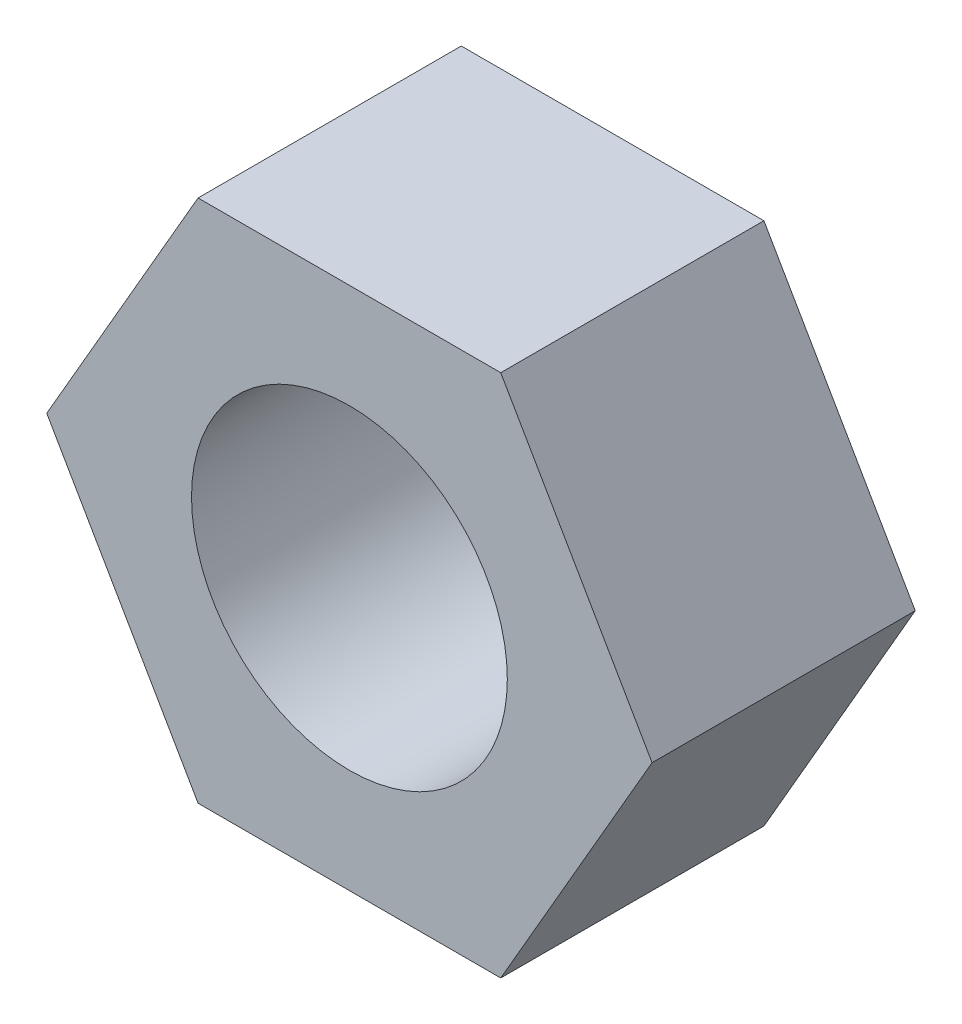
ISO-10303-21;
HEADER;
FILE_DESCRIPTION(('STEP AP214'),'2;1');
FILE_NAME('part.step','',(''),(''),'','','');
FILE_SCHEMA(('AUTOMOTIVE_DESIGN { 1 0 10303 214 1 1 1 1 }'));
ENDSEC;
DATA;
#1=APPLICATION_CONTEXT('core data for automotive mechanical design processes');
#2=APPLICATION_PROTOCOL_DEFINITION('international standard','automotive_design',2000,#1);
#3=PRODUCT_CONTEXT('',#1,'mechanical');
#4=PRODUCT('Part','Part','',(#3));
#5=PRODUCT_RELATED_PRODUCT_CATEGORY('part','',(#4));
#6=PRODUCT_DEFINITION_FORMATION('','',#4);
#7=PRODUCT_DEFINITION_CONTEXT('part definition',#1,'design');
#8=PRODUCT_DEFINITION('design','',#6,#7);
#9=PRODUCT_DEFINITION_SHAPE('','',#8);
#10=(LENGTH_UNIT() NAMED_UNIT(*) SI_UNIT(.MILLI.,.METRE.));
#11=(NAMED_UNIT(*) PLANE_ANGLE_UNIT() SI_UNIT($,.RADIAN.));
#12=(NAMED_UNIT(*) SI_UNIT($,.STERADIAN.) SOLID_ANGLE_UNIT());
#13=UNCERTAINTY_MEASURE_WITH_UNIT(LENGTH_MEASURE(1.E-05),#10,'distance_accuracy_value','');
#14=(GEOMETRIC_REPRESENTATION_CONTEXT(3) GLOBAL_UNCERTAINTY_ASSIGNED_CONTEXT((#13)) GLOBAL_UNIT_ASSIGNED_CONTEXT((#10,
#11,#12)) REPRESENTATION_CONTEXT('',''));
#15=CARTESIAN_POINT('',(0.,0.,0.));
#16=DIRECTION('',(0.,0.,1.));
#17=DIRECTION('',(1.,0.,0.));
#18=AXIS2_PLACEMENT_3D('',#15,#16,#17);
#19=CARTESIAN_POINT('',(0.,0.,5.));
#20=DIRECTION('',(0.,0.,1.));
#21=DIRECTION('',(1.,0.,0.));
#22=AXIS2_PLACEMENT_3D('',#19,#20,#21);
#23=PLANE('',#22);
#24=DIRECTION('',(-1.,0.,0.));
#25=VECTOR('',#24,1.);
#26=CARTESIAN_POINT('',(2.875,4.97964607176052,5.));
#27=LINE('',#26,#25);
#28=CARTESIAN_POINT('',(2.875,4.97964607176052,5.));
#29=VERTEX_POINT('',#28);
#30=CARTESIAN_POINT('',(-2.875,4.97964607176052,5.));
#31=VERTEX_POINT('',#30);
#32=EDGE_CURVE('E130',#29,#31,#27,.T.);
#33=ORIENTED_EDGE('',*,*,#32,.T.);
#34=DIRECTION('',(-0.5,-0.866025403784439,0.));
#35=VECTOR('',#34,1.);
#36=CARTESIAN_POINT('',(-2.875,4.97964607176052,5.));
#37=LINE('',#36,#35);
#38=CARTESIAN_POINT('',(-5.75,0.,5.));
#39=VERTEX_POINT('',#38);
#40=EDGE_CURVE('E88',#31,#39,#37,.T.);
#41=ORIENTED_EDGE('',*,*,#40,.T.);
#42=DIRECTION('',(0.5,-0.866025403784438,0.));
#43=VECTOR('',#42,1.);
#44=CARTESIAN_POINT('',(-5.75,0.,5.));
#45=LINE('',#44,#43);
#46=CARTESIAN_POINT('',(-2.87499999999999,-4.97964607176052,5.));
#47=VERTEX_POINT('',#46);
#48=EDGE_CURVE('E101',#39,#47,#45,.T.);
#49=ORIENTED_EDGE('',*,*,#48,.T.);
#50=DIRECTION('',(1.,0.,0.));
#51=VECTOR('',#50,1.);
#52=CARTESIAN_POINT('',(-2.87499999999999,-4.97964607176052,5.));
#53=LINE('',#52,#51);
#54=CARTESIAN_POINT('',(2.875,-4.97964607176052,5.));
#55=VERTEX_POINT('',#54);
#56=EDGE_CURVE('E95',#47,#55,#53,.T.);
#57=ORIENTED_EDGE('',*,*,#56,.T.);
#58=DIRECTION('',(0.5,0.866025403784439,0.));
#59=VECTOR('',#58,1.);
#60=CARTESIAN_POINT('',(2.875,-4.97964607176052,5.));
#61=LINE('',#60,#59);
#62=CARTESIAN_POINT('',(5.75,0.,5.));
#63=VERTEX_POINT('',#62);
#64=EDGE_CURVE('E99',#55,#63,#61,.T.);
#65=ORIENTED_EDGE('',*,*,#64,.T.);
#66=DIRECTION('',(-0.5,0.866025403784439,0.));
#67=VECTOR('',#66,1.);
#68=CARTESIAN_POINT('',(5.75,0.,5.));
#69=LINE('',#68,#67);
#70=EDGE_CURVE('E51',#63,#29,#69,.T.);
#71=ORIENTED_EDGE('',*,*,#70,.T.);
#72=EDGE_LOOP('',(#33,#41,#49,#57,#65,#71));
#73=FACE_BOUND('',#72,.T.);
#74=CARTESIAN_POINT('',(0.,0.,5.));
#75=DIRECTION('',(0.,0.,1.));
#76=DIRECTION('',(1.,0.,0.));
#77=AXIS2_PLACEMENT_3D('',#74,#75,#76);
#78=CIRCLE('',#77,3.);
#79=CARTESIAN_POINT('',(3.,0.,5.));
#80=VERTEX_POINT('',#79);
#81=EDGE_CURVE('E123',#80,#80,#78,.T.);
#82=ORIENTED_EDGE('',*,*,#81,.F.);
#83=EDGE_LOOP('',(#82));
#84=FACE_BOUND('',#83,.T.);
#85=ADVANCED_FACE('F34',(#73,#84),#23,.T.);
#86=CARTESIAN_POINT('',(0.,0.,0.));
#87=DIRECTION('',(0.,0.,1.));
#88=DIRECTION('',(1.,0.,0.));
#89=AXIS2_PLACEMENT_3D('',#86,#87,#88);
#90=PLANE('',#89);
#91=DIRECTION('',(-1.,0.,0.));
#92=VECTOR('',#91,1.);
#93=CARTESIAN_POINT('',(2.875,4.97964607176052,0.));
#94=LINE('',#93,#92);
#95=CARTESIAN_POINT('',(2.875,4.97964607176052,0.));
#96=VERTEX_POINT('',#95);
#97=CARTESIAN_POINT('',(-2.875,4.97964607176052,0.));
#98=VERTEX_POINT('',#97);
#99=EDGE_CURVE('E119',#96,#98,#94,.T.);
#100=ORIENTED_EDGE('',*,*,#99,.F.);
#101=DIRECTION('',(-0.5,0.866025403784439,0.));
#102=VECTOR('',#101,1.);
#103=CARTESIAN_POINT('',(5.75,0.,0.));
#104=LINE('',#103,#102);
#105=CARTESIAN_POINT('',(5.75,0.,0.));
#106=VERTEX_POINT('',#105);
#107=EDGE_CURVE('E80',#106,#96,#104,.T.);
#108=ORIENTED_EDGE('',*,*,#107,.F.);
#109=DIRECTION('',(0.5,0.866025403784439,0.));
#110=VECTOR('',#109,1.);
#111=CARTESIAN_POINT('',(2.875,-4.97964607176052,0.));
#112=LINE('',#111,#110);
#113=CARTESIAN_POINT('',(2.875,-4.97964607176052,0.));
#114=VERTEX_POINT('',#113);
#115=EDGE_CURVE('E74',#114,#106,#112,.T.);
#116=ORIENTED_EDGE('',*,*,#115,.F.);
#117=DIRECTION('',(1.,0.,0.));
#118=VECTOR('',#117,1.);
#119=CARTESIAN_POINT('',(-2.87499999999999,-4.97964607176052,0.));
#120=LINE('',#119,#118);
#121=CARTESIAN_POINT('',(-2.87499999999999,-4.97964607176052,0.));
#122=VERTEX_POINT('',#121);
#123=EDGE_CURVE('E109',#122,#114,#120,.T.);
#124=ORIENTED_EDGE('',*,*,#123,.F.);
#125=DIRECTION('',(0.5,-0.866025403784438,0.));
#126=VECTOR('',#125,1.);
#127=CARTESIAN_POINT('',(-5.75,0.,0.));
#128=LINE('',#127,#126);
#129=CARTESIAN_POINT('',(-5.75,0.,0.));
#130=VERTEX_POINT('',#129);
#131=EDGE_CURVE('E125',#130,#122,#128,.T.);
#132=ORIENTED_EDGE('',*,*,#131,.F.);
#133=DIRECTION('',(-0.5,-0.866025403784439,0.));
#134=VECTOR('',#133,1.);
#135=CARTESIAN_POINT('',(-2.875,4.97964607176052,0.));
#136=LINE('',#135,#134);
#137=EDGE_CURVE('E122',#98,#130,#136,.T.);
#138=ORIENTED_EDGE('',*,*,#137,.F.);
#139=EDGE_LOOP('',(#100,#108,#116,#124,#132,#138));
#140=FACE_BOUND('',#139,.T.);
#141=CARTESIAN_POINT('',(0.,0.,0.));
#142=DIRECTION('',(0.,0.,1.));
#143=DIRECTION('',(1.,0.,0.));
#144=AXIS2_PLACEMENT_3D('',#141,#142,#143);
#145=CIRCLE('',#144,3.);
#146=CARTESIAN_POINT('',(3.,0.,0.));
#147=VERTEX_POINT('',#146);
#148=EDGE_CURVE('E223',#147,#147,#145,.T.);
#149=ORIENTED_EDGE('',*,*,#148,.T.);
#150=EDGE_LOOP('',(#149));
#151=FACE_BOUND('',#150,.T.);
#152=ADVANCED_FACE('F139',(#140,#151),#90,.F.);
#153=CARTESIAN_POINT('',(2.875,4.97964607176052,5.));
#154=DIRECTION('',(0.,-1.,0.));
#155=DIRECTION('',(1.,0.,0.));
#156=AXIS2_PLACEMENT_3D('',#153,#154,#155);
#157=PLANE('',#156);
#158=ORIENTED_EDGE('',*,*,#99,.T.);
#159=DIRECTION('',(0.,0.,-1.));
#160=VECTOR('',#159,1.);
#161=CARTESIAN_POINT('',(-2.875,4.97964607176052,5.));
#162=LINE('',#161,#160);
#163=EDGE_CURVE('E11',#31,#98,#162,.T.);
#164=ORIENTED_EDGE('',*,*,#163,.F.);
#165=ORIENTED_EDGE('',*,*,#32,.F.);
#166=DIRECTION('',(0.,0.,-1.));
#167=VECTOR('',#166,1.);
#168=CARTESIAN_POINT('',(2.875,4.97964607176052,5.));
#169=LINE('',#168,#167);
#170=EDGE_CURVE('E115',#29,#96,#169,.T.);
#171=ORIENTED_EDGE('',*,*,#170,.T.);
#172=EDGE_LOOP('',(#158,#164,#165,#171));
#173=FACE_BOUND('',#172,.T.);
#174=ADVANCED_FACE('F36',(#173),#157,.F.);
#175=CARTESIAN_POINT('',(-2.875,4.97964607176052,5.));
#176=DIRECTION('',(0.866025403784439,-0.5,0.));
#177=DIRECTION('',(0.5,0.866025403784439,0.));
#178=AXIS2_PLACEMENT_3D('',#175,#176,#177);
#179=PLANE('',#178);
#180=ORIENTED_EDGE('',*,*,#137,.T.);
#181=DIRECTION('',(0.,0.,-1.));
#182=VECTOR('',#181,1.);
#183=CARTESIAN_POINT('',(-5.75,0.,5.));
#184=LINE('',#183,#182);
#185=EDGE_CURVE('E43',#39,#130,#184,.T.);
#186=ORIENTED_EDGE('',*,*,#185,.F.);
#187=ORIENTED_EDGE('',*,*,#40,.F.);
#188=ORIENTED_EDGE('',*,*,#163,.T.);
#189=EDGE_LOOP('',(#180,#186,#187,#188));
#190=FACE_BOUND('',#189,.T.);
#191=ADVANCED_FACE('F164',(#190),#179,.F.);
#192=CARTESIAN_POINT('',(-5.75,0.,5.));
#193=DIRECTION('',(0.866025403784438,0.5,0.));
#194=DIRECTION('',(-0.5,0.866025403784439,0.));
#195=AXIS2_PLACEMENT_3D('',#192,#193,#194);
#196=PLANE('',#195);
#197=ORIENTED_EDGE('',*,*,#131,.T.);
#198=DIRECTION('',(0.,0.,-1.));
#199=VECTOR('',#198,1.);
#200=CARTESIAN_POINT('',(-2.87499999999999,-4.97964607176052,5.));
#201=LINE('',#200,#199);
#202=EDGE_CURVE('E110',#47,#122,#201,.T.);
#203=ORIENTED_EDGE('',*,*,#202,.F.);
#204=ORIENTED_EDGE('',*,*,#48,.F.);
#205=ORIENTED_EDGE('',*,*,#185,.T.);
#206=EDGE_LOOP('',(#197,#203,#204,#205));
#207=FACE_BOUND('',#206,.T.);
#208=ADVANCED_FACE('F136',(#207),#196,.F.);
#209=CARTESIAN_POINT('',(-2.87499999999999,-4.97964607176052,5.));
#210=DIRECTION('',(0.,1.,0.));
#211=DIRECTION('',(-1.,0.,0.));
#212=AXIS2_PLACEMENT_3D('',#209,#210,#211);
#213=PLANE('',#212);
#214=ORIENTED_EDGE('',*,*,#123,.T.);
#215=DIRECTION('',(0.,0.,-1.));
#216=VECTOR('',#215,1.);
#217=CARTESIAN_POINT('',(2.875,-4.97964607176052,5.));
#218=LINE('',#217,#216);
#219=EDGE_CURVE('E106',#55,#114,#218,.T.);
#220=ORIENTED_EDGE('',*,*,#219,.F.);
#221=ORIENTED_EDGE('',*,*,#56,.F.);
#222=ORIENTED_EDGE('',*,*,#202,.T.);
#223=EDGE_LOOP('',(#214,#220,#221,#222));
#224=FACE_BOUND('',#223,.T.);
#225=ADVANCED_FACE('F107',(#224),#213,.F.);
#226=CARTESIAN_POINT('',(2.875,-4.97964607176052,5.));
#227=DIRECTION('',(-0.866025403784439,0.5,0.));
#228=DIRECTION('',(-0.5,-0.866025403784439,0.));
#229=AXIS2_PLACEMENT_3D('',#226,#227,#228);
#230=PLANE('',#229);
#231=ORIENTED_EDGE('',*,*,#115,.T.);
#232=DIRECTION('',(0.,0.,-1.));
#233=VECTOR('',#232,1.);
#234=CARTESIAN_POINT('',(5.75,0.,5.));
#235=LINE('',#234,#233);
#236=EDGE_CURVE('E111',#63,#106,#235,.T.);
#237=ORIENTED_EDGE('',*,*,#236,.F.);
#238=ORIENTED_EDGE('',*,*,#64,.F.);
#239=ORIENTED_EDGE('',*,*,#219,.T.);
#240=EDGE_LOOP('',(#231,#237,#238,#239));
#241=FACE_BOUND('',#240,.T.);
#242=ADVANCED_FACE('F113',(#241),#230,.F.);
#243=CARTESIAN_POINT('',(5.75,0.,5.));
#244=DIRECTION('',(-0.866025403784438,-0.5,0.));
#245=DIRECTION('',(0.5,-0.866025403784439,0.));
#246=AXIS2_PLACEMENT_3D('',#243,#244,#245);
#247=PLANE('',#246);
#248=ORIENTED_EDGE('',*,*,#107,.T.);
#249=ORIENTED_EDGE('',*,*,#170,.F.);
#250=ORIENTED_EDGE('',*,*,#70,.F.);
#251=ORIENTED_EDGE('',*,*,#236,.T.);
#252=EDGE_LOOP('',(#248,#249,#250,#251));
#253=FACE_BOUND('',#252,.T.);
#254=ADVANCED_FACE('F144',(#253),#247,.F.);
#255=CARTESIAN_POINT('',(0.,0.,5.));
#256=DIRECTION('',(0.,0.,-1.));
#257=DIRECTION('',(-1.,0.,0.));
#258=AXIS2_PLACEMENT_3D('',#255,#256,#257);
#259=CYLINDRICAL_SURFACE('',#258,3.);
#260=ORIENTED_EDGE('',*,*,#81,.T.);
#261=EDGE_LOOP('',(#260));
#262=FACE_BOUND('',#261,.T.);
#263=ORIENTED_EDGE('',*,*,#148,.F.);
#264=EDGE_LOOP('',(#263));
#265=FACE_BOUND('',#264,.T.);
#266=ADVANCED_FACE('F146',(#262,#265),#259,.F.);
#267=CLOSED_SHELL('',(#85,#152,#174,#191,#208,#225,#242,#254,#266));
#268=MANIFOLD_SOLID_BREP('B2',#267);
#269=ADVANCED_BREP_SHAPE_REPRESENTATION('',(#18,#268),#14);
#270=SHAPE_DEFINITION_REPRESENTATION(#9,#269);
ENDSEC;
END-ISO-10303-21;
